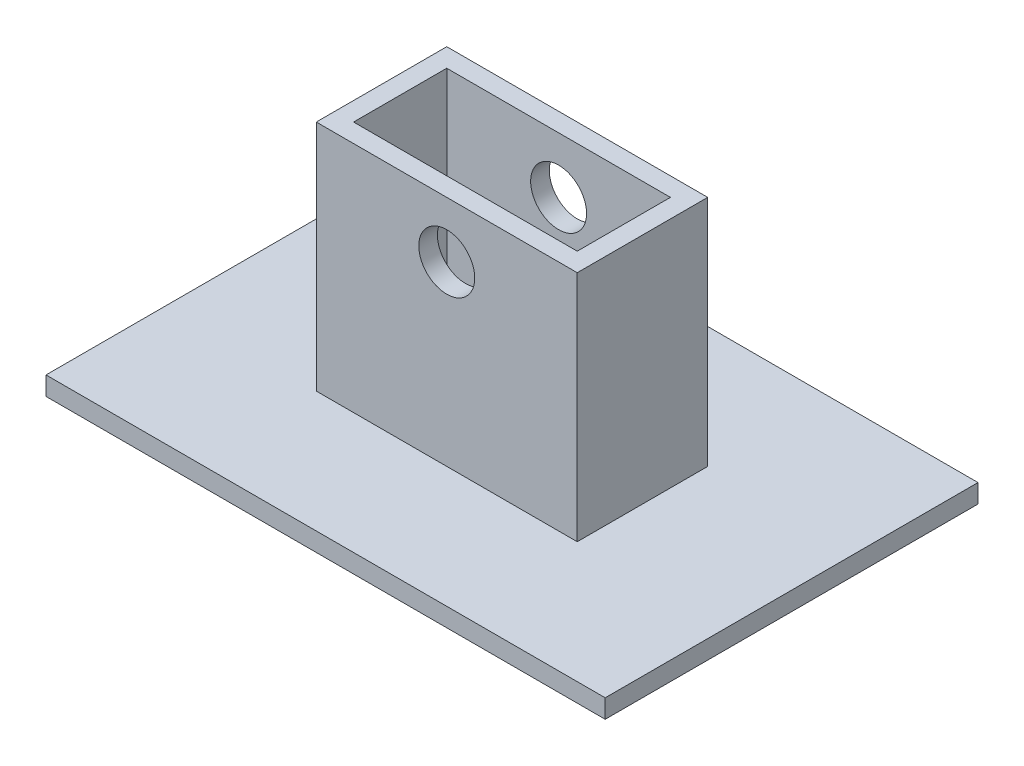
ISO-10303-21;
HEADER;
FILE_DESCRIPTION(('STEP AP214'),'2;1');
FILE_NAME('part.step','',(''),(''),'','','');
FILE_SCHEMA(('AUTOMOTIVE_DESIGN { 1 0 10303 214 1 1 1 1 }'));
ENDSEC;
DATA;
#1=APPLICATION_CONTEXT('core data for automotive mechanical design processes');
#2=APPLICATION_PROTOCOL_DEFINITION('international standard','automotive_design',2000,#1);
#3=PRODUCT_CONTEXT('',#1,'mechanical');
#4=PRODUCT('Part','Part','',(#3));
#5=PRODUCT_RELATED_PRODUCT_CATEGORY('part','',(#4));
#6=PRODUCT_DEFINITION_FORMATION('','',#4);
#7=PRODUCT_DEFINITION_CONTEXT('part definition',#1,'design');
#8=PRODUCT_DEFINITION('design','',#6,#7);
#9=PRODUCT_DEFINITION_SHAPE('','',#8);
#10=(LENGTH_UNIT() NAMED_UNIT(*) SI_UNIT(.MILLI.,.METRE.));
#11=(NAMED_UNIT(*) PLANE_ANGLE_UNIT() SI_UNIT($,.RADIAN.));
#12=(NAMED_UNIT(*) SI_UNIT($,.STERADIAN.) SOLID_ANGLE_UNIT());
#13=UNCERTAINTY_MEASURE_WITH_UNIT(LENGTH_MEASURE(1.E-05),#10,'distance_accuracy_value','');
#14=(GEOMETRIC_REPRESENTATION_CONTEXT(3) GLOBAL_UNCERTAINTY_ASSIGNED_CONTEXT((#13)) GLOBAL_UNIT_ASSIGNED_CONTEXT((#10,
#11,#12)) REPRESENTATION_CONTEXT('',''));
#15=CARTESIAN_POINT('',(0.,0.,0.));
#16=DIRECTION('',(0.,0.,1.));
#17=DIRECTION('',(1.,0.,0.));
#18=AXIS2_PLACEMENT_3D('',#15,#16,#17);
#19=CARTESIAN_POINT('',(0.,2.54,0.));
#20=DIRECTION('',(0.,1.,0.));
#21=DIRECTION('',(0.,0.,1.));
#22=AXIS2_PLACEMENT_3D('',#19,#20,#21);
#23=PLANE('',#22);
#24=DIRECTION('',(0.,0.,1.));
#25=VECTOR('',#24,1.);
#26=CARTESIAN_POINT('',(-38.1,2.54,-25.4));
#27=LINE('',#26,#25);
#28=CARTESIAN_POINT('',(-38.1,2.54,-25.4));
#29=VERTEX_POINT('',#28);
#30=CARTESIAN_POINT('',(-38.1,2.54,25.4));
#31=VERTEX_POINT('',#30);
#32=EDGE_CURVE('E193',#29,#31,#27,.T.);
#33=ORIENTED_EDGE('',*,*,#32,.T.);
#34=DIRECTION('',(1.,0.,0.));
#35=VECTOR('',#34,1.);
#36=CARTESIAN_POINT('',(-38.1,2.54,25.4));
#37=LINE('',#36,#35);
#38=CARTESIAN_POINT('',(38.1,2.54,25.4));
#39=VERTEX_POINT('',#38);
#40=EDGE_CURVE('E196',#31,#39,#37,.T.);
#41=ORIENTED_EDGE('',*,*,#40,.T.);
#42=DIRECTION('',(0.,0.,-1.));
#43=VECTOR('',#42,1.);
#44=CARTESIAN_POINT('',(38.1,2.54,-25.4));
#45=LINE('',#44,#43);
#46=CARTESIAN_POINT('',(38.1,2.54,-25.4));
#47=VERTEX_POINT('',#46);
#48=EDGE_CURVE('E199',#39,#47,#45,.T.);
#49=ORIENTED_EDGE('',*,*,#48,.T.);
#50=DIRECTION('',(-1.,0.,0.));
#51=VECTOR('',#50,1.);
#52=CARTESIAN_POINT('',(-38.1,2.54,-25.4));
#53=LINE('',#52,#51);
#54=EDGE_CURVE('E201',#47,#29,#53,.T.);
#55=ORIENTED_EDGE('',*,*,#54,.T.);
#56=EDGE_LOOP('',(#33,#41,#49,#55));
#57=FACE_BOUND('',#56,.T.);
#58=DIRECTION('',(1.,0.,0.));
#59=VECTOR('',#58,1.);
#60=CARTESIAN_POINT('',(-17.78,2.54,8.89));
#61=LINE('',#60,#59);
#62=CARTESIAN_POINT('',(-17.78,2.54,8.89));
#63=VERTEX_POINT('',#62);
#64=CARTESIAN_POINT('',(17.78,2.54,8.89));
#65=VERTEX_POINT('',#64);
#66=EDGE_CURVE('E179',#63,#65,#61,.T.);
#67=ORIENTED_EDGE('',*,*,#66,.F.);
#68=DIRECTION('',(0.,0.,1.));
#69=VECTOR('',#68,1.);
#70=CARTESIAN_POINT('',(-17.78,2.54,-8.89));
#71=LINE('',#70,#69);
#72=CARTESIAN_POINT('',(-17.78,2.54,-8.89));
#73=VERTEX_POINT('',#72);
#74=EDGE_CURVE('E142',#73,#63,#71,.T.);
#75=ORIENTED_EDGE('',*,*,#74,.F.);
#76=DIRECTION('',(-1.,0.,0.));
#77=VECTOR('',#76,1.);
#78=CARTESIAN_POINT('',(-17.78,2.54,-8.89));
#79=LINE('',#78,#77);
#80=CARTESIAN_POINT('',(17.78,2.54,-8.89));
#81=VERTEX_POINT('',#80);
#82=EDGE_CURVE('E170',#81,#73,#79,.T.);
#83=ORIENTED_EDGE('',*,*,#82,.F.);
#84=DIRECTION('',(0.,0.,-1.));
#85=VECTOR('',#84,1.);
#86=CARTESIAN_POINT('',(17.78,2.54,-8.89));
#87=LINE('',#86,#85);
#88=EDGE_CURVE('E181',#65,#81,#87,.T.);
#89=ORIENTED_EDGE('',*,*,#88,.F.);
#90=EDGE_LOOP('',(#67,#75,#83,#89));
#91=FACE_BOUND('',#90,.T.);
#92=ADVANCED_FACE('F33',(#57,#91),#23,.T.);
#93=CARTESIAN_POINT('',(-38.1,2.54,-25.4));
#94=DIRECTION('',(1.,0.,0.));
#95=DIRECTION('',(0.,0.,-1.));
#96=AXIS2_PLACEMENT_3D('',#93,#94,#95);
#97=PLANE('',#96);
#98=DIRECTION('',(0.,0.,1.));
#99=VECTOR('',#98,1.);
#100=CARTESIAN_POINT('',(-38.1,0.,-25.4));
#101=LINE('',#100,#99);
#102=CARTESIAN_POINT('',(-38.1,0.,-25.4));
#103=VERTEX_POINT('',#102);
#104=CARTESIAN_POINT('',(-38.1,0.,25.4));
#105=VERTEX_POINT('',#104);
#106=EDGE_CURVE('E192',#103,#105,#101,.T.);
#107=ORIENTED_EDGE('',*,*,#106,.T.);
#108=DIRECTION('',(0.,-1.,0.));
#109=VECTOR('',#108,1.);
#110=CARTESIAN_POINT('',(-38.1,2.54,25.4));
#111=LINE('',#110,#109);
#112=EDGE_CURVE('E11',#31,#105,#111,.T.);
#113=ORIENTED_EDGE('',*,*,#112,.F.);
#114=ORIENTED_EDGE('',*,*,#32,.F.);
#115=DIRECTION('',(0.,-1.,0.));
#116=VECTOR('',#115,1.);
#117=CARTESIAN_POINT('',(-38.1,2.54,-25.4));
#118=LINE('',#117,#116);
#119=EDGE_CURVE('E203',#29,#103,#118,.T.);
#120=ORIENTED_EDGE('',*,*,#119,.T.);
#121=EDGE_LOOP('',(#107,#113,#114,#120));
#122=FACE_BOUND('',#121,.T.);
#123=ADVANCED_FACE('F35',(#122),#97,.F.);
#124=CARTESIAN_POINT('',(-38.1,2.54,25.4));
#125=DIRECTION('',(0.,0.,-1.));
#126=DIRECTION('',(-1.,0.,0.));
#127=AXIS2_PLACEMENT_3D('',#124,#125,#126);
#128=PLANE('',#127);
#129=DIRECTION('',(1.,0.,0.));
#130=VECTOR('',#129,1.);
#131=CARTESIAN_POINT('',(-38.1,0.,25.4));
#132=LINE('',#131,#130);
#133=CARTESIAN_POINT('',(38.1,0.,25.4));
#134=VERTEX_POINT('',#133);
#135=EDGE_CURVE('E206',#105,#134,#132,.T.);
#136=ORIENTED_EDGE('',*,*,#135,.T.);
#137=DIRECTION('',(0.,-1.,0.));
#138=VECTOR('',#137,1.);
#139=CARTESIAN_POINT('',(38.1,2.54,25.4));
#140=LINE('',#139,#138);
#141=EDGE_CURVE('E42',#39,#134,#140,.T.);
#142=ORIENTED_EDGE('',*,*,#141,.F.);
#143=ORIENTED_EDGE('',*,*,#40,.F.);
#144=ORIENTED_EDGE('',*,*,#112,.T.);
#145=EDGE_LOOP('',(#136,#142,#143,#144));
#146=FACE_BOUND('',#145,.T.);
#147=ADVANCED_FACE('F237',(#146),#128,.F.);
#148=CARTESIAN_POINT('',(38.1,2.54,-25.4));
#149=DIRECTION('',(-1.,0.,0.));
#150=DIRECTION('',(0.,0.,1.));
#151=AXIS2_PLACEMENT_3D('',#148,#149,#150);
#152=PLANE('',#151);
#153=DIRECTION('',(0.,0.,-1.));
#154=VECTOR('',#153,1.);
#155=CARTESIAN_POINT('',(38.1,0.,-25.4));
#156=LINE('',#155,#154);
#157=CARTESIAN_POINT('',(38.1,0.,-25.4));
#158=VERTEX_POINT('',#157);
#159=EDGE_CURVE('E208',#134,#158,#156,.T.);
#160=ORIENTED_EDGE('',*,*,#159,.T.);
#161=DIRECTION('',(0.,-1.,0.));
#162=VECTOR('',#161,1.);
#163=CARTESIAN_POINT('',(38.1,2.54,-25.4));
#164=LINE('',#163,#162);
#165=EDGE_CURVE('E213',#47,#158,#164,.T.);
#166=ORIENTED_EDGE('',*,*,#165,.F.);
#167=ORIENTED_EDGE('',*,*,#48,.F.);
#168=ORIENTED_EDGE('',*,*,#141,.T.);
#169=EDGE_LOOP('',(#160,#166,#167,#168));
#170=FACE_BOUND('',#169,.T.);
#171=ADVANCED_FACE('F221',(#170),#152,.F.);
#172=CARTESIAN_POINT('',(-38.1,2.54,-25.4));
#173=DIRECTION('',(0.,0.,1.));
#174=DIRECTION('',(1.,0.,0.));
#175=AXIS2_PLACEMENT_3D('',#172,#173,#174);
#176=PLANE('',#175);
#177=DIRECTION('',(-1.,0.,0.));
#178=VECTOR('',#177,1.);
#179=CARTESIAN_POINT('',(-38.1,0.,-25.4));
#180=LINE('',#179,#178);
#181=EDGE_CURVE('E197',#158,#103,#180,.T.);
#182=ORIENTED_EDGE('',*,*,#181,.T.);
#183=ORIENTED_EDGE('',*,*,#119,.F.);
#184=ORIENTED_EDGE('',*,*,#54,.F.);
#185=ORIENTED_EDGE('',*,*,#165,.T.);
#186=EDGE_LOOP('',(#182,#183,#184,#185));
#187=FACE_BOUND('',#186,.T.);
#188=ADVANCED_FACE('F230',(#187),#176,.F.);
#189=CARTESIAN_POINT('',(0.,0.,0.));
#190=DIRECTION('',(0.,1.,0.));
#191=DIRECTION('',(0.,0.,1.));
#192=AXIS2_PLACEMENT_3D('',#189,#190,#191);
#193=PLANE('',#192);
#194=ORIENTED_EDGE('',*,*,#106,.F.);
#195=ORIENTED_EDGE('',*,*,#181,.F.);
#196=ORIENTED_EDGE('',*,*,#159,.F.);
#197=ORIENTED_EDGE('',*,*,#135,.F.);
#198=EDGE_LOOP('',(#194,#195,#196,#197));
#199=FACE_BOUND('',#198,.T.);
#200=ADVANCED_FACE('F227',(#199),#193,.F.);
#201=CARTESIAN_POINT('',(0.,34.29,0.));
#202=DIRECTION('',(0.,1.,0.));
#203=DIRECTION('',(0.,0.,1.));
#204=AXIS2_PLACEMENT_3D('',#201,#202,#203);
#205=PLANE('',#204);
#206=DIRECTION('',(0.,0.,1.));
#207=VECTOR('',#206,1.);
#208=CARTESIAN_POINT('',(-17.78,34.29,-8.89));
#209=LINE('',#208,#207);
#210=CARTESIAN_POINT('',(-17.78,34.29,-8.89));
#211=VERTEX_POINT('',#210);
#212=CARTESIAN_POINT('',(-17.78,34.29,8.89));
#213=VERTEX_POINT('',#212);
#214=EDGE_CURVE('E166',#211,#213,#209,.T.);
#215=ORIENTED_EDGE('',*,*,#214,.T.);
#216=DIRECTION('',(1.,0.,0.));
#217=VECTOR('',#216,1.);
#218=CARTESIAN_POINT('',(-17.78,34.29,8.89));
#219=LINE('',#218,#217);
#220=CARTESIAN_POINT('',(17.78,34.29,8.89));
#221=VERTEX_POINT('',#220);
#222=EDGE_CURVE('E169',#213,#221,#219,.T.);
#223=ORIENTED_EDGE('',*,*,#222,.T.);
#224=DIRECTION('',(0.,0.,-1.));
#225=VECTOR('',#224,1.);
#226=CARTESIAN_POINT('',(17.78,34.29,-8.89));
#227=LINE('',#226,#225);
#228=CARTESIAN_POINT('',(17.78,34.29,-8.89));
#229=VERTEX_POINT('',#228);
#230=EDGE_CURVE('E172',#221,#229,#227,.T.);
#231=ORIENTED_EDGE('',*,*,#230,.T.);
#232=DIRECTION('',(-1.,0.,0.));
#233=VECTOR('',#232,1.);
#234=CARTESIAN_POINT('',(-17.78,34.29,-8.89));
#235=LINE('',#234,#233);
#236=EDGE_CURVE('E174',#229,#211,#235,.T.);
#237=ORIENTED_EDGE('',*,*,#236,.T.);
#238=EDGE_LOOP('',(#215,#223,#231,#237));
#239=FACE_BOUND('',#238,.T.);
#240=DIRECTION('',(1.,0.,0.));
#241=VECTOR('',#240,1.);
#242=CARTESIAN_POINT('',(-15.24,34.29,6.35));
#243=LINE('',#242,#241);
#244=CARTESIAN_POINT('',(-15.24,34.29,6.35));
#245=VERTEX_POINT('',#244);
#246=CARTESIAN_POINT('',(15.24,34.29,6.35));
#247=VERTEX_POINT('',#246);
#248=EDGE_CURVE('E134',#245,#247,#243,.T.);
#249=ORIENTED_EDGE('',*,*,#248,.F.);
#250=DIRECTION('',(0.,0.,1.));
#251=VECTOR('',#250,1.);
#252=CARTESIAN_POINT('',(-15.24,34.29,-6.35));
#253=LINE('',#252,#251);
#254=CARTESIAN_POINT('',(-15.24,34.29,-6.35));
#255=VERTEX_POINT('',#254);
#256=EDGE_CURVE('E125',#255,#245,#253,.T.);
#257=ORIENTED_EDGE('',*,*,#256,.F.);
#258=DIRECTION('',(-1.,0.,0.));
#259=VECTOR('',#258,1.);
#260=CARTESIAN_POINT('',(-15.24,34.29,-6.35));
#261=LINE('',#260,#259);
#262=CARTESIAN_POINT('',(15.24,34.29,-6.35));
#263=VERTEX_POINT('',#262);
#264=EDGE_CURVE('E150',#263,#255,#261,.T.);
#265=ORIENTED_EDGE('',*,*,#264,.F.);
#266=DIRECTION('',(0.,0.,-1.));
#267=VECTOR('',#266,1.);
#268=CARTESIAN_POINT('',(15.24,34.29,-6.35));
#269=LINE('',#268,#267);
#270=EDGE_CURVE('E148',#247,#263,#269,.T.);
#271=ORIENTED_EDGE('',*,*,#270,.F.);
#272=EDGE_LOOP('',(#249,#257,#265,#271));
#273=FACE_BOUND('',#272,.T.);
#274=ADVANCED_FACE('F146',(#239,#273),#205,.T.);
#275=CARTESIAN_POINT('',(-17.78,34.29,-8.89));
#276=DIRECTION('',(1.,0.,0.));
#277=DIRECTION('',(0.,0.,-1.));
#278=AXIS2_PLACEMENT_3D('',#275,#276,#277);
#279=PLANE('',#278);
#280=ORIENTED_EDGE('',*,*,#74,.T.);
#281=DIRECTION('',(0.,-1.,0.));
#282=VECTOR('',#281,1.);
#283=CARTESIAN_POINT('',(-17.78,34.29,8.89));
#284=LINE('',#283,#282);
#285=EDGE_CURVE('E190',#213,#63,#284,.T.);
#286=ORIENTED_EDGE('',*,*,#285,.F.);
#287=ORIENTED_EDGE('',*,*,#214,.F.);
#288=DIRECTION('',(0.,-1.,0.));
#289=VECTOR('',#288,1.);
#290=CARTESIAN_POINT('',(-17.78,34.29,-8.89));
#291=LINE('',#290,#289);
#292=EDGE_CURVE('E176',#211,#73,#291,.T.);
#293=ORIENTED_EDGE('',*,*,#292,.T.);
#294=EDGE_LOOP('',(#280,#286,#287,#293));
#295=FACE_BOUND('',#294,.T.);
#296=ADVANCED_FACE('F280',(#295),#279,.F.);
#297=CARTESIAN_POINT('',(-17.78,34.29,8.89));
#298=DIRECTION('',(0.,0.,-1.));
#299=DIRECTION('',(-1.,0.,0.));
#300=AXIS2_PLACEMENT_3D('',#297,#298,#299);
#301=PLANE('',#300);
#302=CARTESIAN_POINT('',(0.,26.67,8.89));
#303=DIRECTION('',(0.,0.,1.));
#304=DIRECTION('',(1.,0.,0.));
#305=AXIS2_PLACEMENT_3D('',#302,#303,#304);
#306=CIRCLE('',#305,3.81);
#307=CARTESIAN_POINT('',(3.81,26.67,8.89));
#308=VERTEX_POINT('',#307);
#309=EDGE_CURVE('E415',#308,#308,#306,.T.);
#310=ORIENTED_EDGE('',*,*,#309,.F.);
#311=EDGE_LOOP('',(#310));
#312=FACE_BOUND('',#311,.T.);
#313=ORIENTED_EDGE('',*,*,#66,.T.);
#314=DIRECTION('',(0.,-1.,0.));
#315=VECTOR('',#314,1.);
#316=CARTESIAN_POINT('',(17.78,34.29,8.89));
#317=LINE('',#316,#315);
#318=EDGE_CURVE('E187',#221,#65,#317,.T.);
#319=ORIENTED_EDGE('',*,*,#318,.F.);
#320=ORIENTED_EDGE('',*,*,#222,.F.);
#321=ORIENTED_EDGE('',*,*,#285,.T.);
#322=EDGE_LOOP('',(#313,#319,#320,#321));
#323=FACE_BOUND('',#322,.T.);
#324=ADVANCED_FACE('F288',(#312,#323),#301,.F.);
#325=CARTESIAN_POINT('',(17.78,34.29,-8.89));
#326=DIRECTION('',(-1.,0.,0.));
#327=DIRECTION('',(0.,0.,1.));
#328=AXIS2_PLACEMENT_3D('',#325,#326,#327);
#329=PLANE('',#328);
#330=ORIENTED_EDGE('',*,*,#88,.T.);
#331=DIRECTION('',(0.,-1.,0.));
#332=VECTOR('',#331,1.);
#333=CARTESIAN_POINT('',(17.78,34.29,-8.89));
#334=LINE('',#333,#332);
#335=EDGE_CURVE('E49',#229,#81,#334,.T.);
#336=ORIENTED_EDGE('',*,*,#335,.F.);
#337=ORIENTED_EDGE('',*,*,#230,.F.);
#338=ORIENTED_EDGE('',*,*,#318,.T.);
#339=EDGE_LOOP('',(#330,#336,#337,#338));
#340=FACE_BOUND('',#339,.T.);
#341=ADVANCED_FACE('F284',(#340),#329,.F.);
#342=CARTESIAN_POINT('',(-17.78,34.29,-8.89));
#343=DIRECTION('',(0.,0.,1.));
#344=DIRECTION('',(1.,0.,0.));
#345=AXIS2_PLACEMENT_3D('',#342,#343,#344);
#346=PLANE('',#345);
#347=CARTESIAN_POINT('',(0.,26.67,-8.89));
#348=DIRECTION('',(0.,0.,1.));
#349=DIRECTION('',(1.,0.,0.));
#350=AXIS2_PLACEMENT_3D('',#347,#348,#349);
#351=CIRCLE('',#350,3.81);
#352=CARTESIAN_POINT('',(3.81,26.67,-8.89));
#353=VERTEX_POINT('',#352);
#354=EDGE_CURVE('E156',#353,#353,#351,.T.);
#355=ORIENTED_EDGE('',*,*,#354,.T.);
#356=EDGE_LOOP('',(#355));
#357=FACE_BOUND('',#356,.T.);
#358=ORIENTED_EDGE('',*,*,#82,.T.);
#359=ORIENTED_EDGE('',*,*,#292,.F.);
#360=ORIENTED_EDGE('',*,*,#236,.F.);
#361=ORIENTED_EDGE('',*,*,#335,.T.);
#362=EDGE_LOOP('',(#358,#359,#360,#361));
#363=FACE_BOUND('',#362,.T.);
#364=ADVANCED_FACE('F277',(#357,#363),#346,.F.);
#365=CARTESIAN_POINT('',(-15.24,34.29,-6.35));
#366=DIRECTION('',(1.,0.,0.));
#367=DIRECTION('',(0.,0.,-1.));
#368=AXIS2_PLACEMENT_3D('',#365,#366,#367);
#369=PLANE('',#368);
#370=DIRECTION('',(0.,0.,1.));
#371=VECTOR('',#370,1.);
#372=CARTESIAN_POINT('',(-15.24,2.54,-6.35));
#373=LINE('',#372,#371);
#374=CARTESIAN_POINT('',(-15.24,2.54,-6.35));
#375=VERTEX_POINT('',#374);
#376=CARTESIAN_POINT('',(-15.24,2.54,6.35));
#377=VERTEX_POINT('',#376);
#378=EDGE_CURVE('E57',#375,#377,#373,.T.);
#379=ORIENTED_EDGE('',*,*,#378,.F.);
#380=DIRECTION('',(0.,-1.,0.));
#381=VECTOR('',#380,1.);
#382=CARTESIAN_POINT('',(-15.24,34.29,-6.35));
#383=LINE('',#382,#381);
#384=EDGE_CURVE('E130',#255,#375,#383,.T.);
#385=ORIENTED_EDGE('',*,*,#384,.F.);
#386=ORIENTED_EDGE('',*,*,#256,.T.);
#387=DIRECTION('',(0.,-1.,0.));
#388=VECTOR('',#387,1.);
#389=CARTESIAN_POINT('',(-15.24,34.29,6.35));
#390=LINE('',#389,#388);
#391=EDGE_CURVE('E128',#245,#377,#390,.T.);
#392=ORIENTED_EDGE('',*,*,#391,.T.);
#393=EDGE_LOOP('',(#379,#385,#386,#392));
#394=FACE_BOUND('',#393,.T.);
#395=ADVANCED_FACE('F127',(#394),#369,.T.);
#396=CARTESIAN_POINT('',(-15.24,34.29,6.35));
#397=DIRECTION('',(0.,0.,-1.));
#398=DIRECTION('',(-1.,0.,0.));
#399=AXIS2_PLACEMENT_3D('',#396,#397,#398);
#400=PLANE('',#399);
#401=CARTESIAN_POINT('',(0.,26.67,6.35));
#402=DIRECTION('',(0.,0.,-1.));
#403=DIRECTION('',(-1.,0.,0.));
#404=AXIS2_PLACEMENT_3D('',#401,#402,#403);
#405=CIRCLE('',#404,3.81);
#406=CARTESIAN_POINT('',(-3.81,26.67,6.35));
#407=VERTEX_POINT('',#406);
#408=EDGE_CURVE('E412',#407,#407,#405,.T.);
#409=ORIENTED_EDGE('',*,*,#408,.F.);
#410=EDGE_LOOP('',(#409));
#411=FACE_BOUND('',#410,.T.);
#412=DIRECTION('',(1.,0.,0.));
#413=VECTOR('',#412,1.);
#414=CARTESIAN_POINT('',(-15.24,2.54,6.35));
#415=LINE('',#414,#413);
#416=CARTESIAN_POINT('',(15.24,2.54,6.35));
#417=VERTEX_POINT('',#416);
#418=EDGE_CURVE('E141',#377,#417,#415,.T.);
#419=ORIENTED_EDGE('',*,*,#418,.F.);
#420=ORIENTED_EDGE('',*,*,#391,.F.);
#421=ORIENTED_EDGE('',*,*,#248,.T.);
#422=DIRECTION('',(0.,-1.,0.));
#423=VECTOR('',#422,1.);
#424=CARTESIAN_POINT('',(15.24,34.29,6.35));
#425=LINE('',#424,#423);
#426=EDGE_CURVE('E143',#247,#417,#425,.T.);
#427=ORIENTED_EDGE('',*,*,#426,.T.);
#428=EDGE_LOOP('',(#419,#420,#421,#427));
#429=FACE_BOUND('',#428,.T.);
#430=ADVANCED_FACE('F138',(#411,#429),#400,.T.);
#431=CARTESIAN_POINT('',(15.24,34.29,-6.35));
#432=DIRECTION('',(-1.,0.,0.));
#433=DIRECTION('',(0.,0.,1.));
#434=AXIS2_PLACEMENT_3D('',#431,#432,#433);
#435=PLANE('',#434);
#436=DIRECTION('',(0.,0.,-1.));
#437=VECTOR('',#436,1.);
#438=CARTESIAN_POINT('',(15.24,2.54,-6.35));
#439=LINE('',#438,#437);
#440=CARTESIAN_POINT('',(15.24,2.54,-6.35));
#441=VERTEX_POINT('',#440);
#442=EDGE_CURVE('E158',#417,#441,#439,.T.);
#443=ORIENTED_EDGE('',*,*,#442,.F.);
#444=ORIENTED_EDGE('',*,*,#426,.F.);
#445=ORIENTED_EDGE('',*,*,#270,.T.);
#446=DIRECTION('',(0.,-1.,0.));
#447=VECTOR('',#446,1.);
#448=CARTESIAN_POINT('',(15.24,34.29,-6.35));
#449=LINE('',#448,#447);
#450=EDGE_CURVE('E162',#263,#441,#449,.T.);
#451=ORIENTED_EDGE('',*,*,#450,.T.);
#452=EDGE_LOOP('',(#443,#444,#445,#451));
#453=FACE_BOUND('',#452,.T.);
#454=ADVANCED_FACE('F261',(#453),#435,.T.);
#455=CARTESIAN_POINT('',(-15.24,34.29,-6.35));
#456=DIRECTION('',(0.,0.,1.));
#457=DIRECTION('',(1.,0.,0.));
#458=AXIS2_PLACEMENT_3D('',#455,#456,#457);
#459=PLANE('',#458);
#460=CARTESIAN_POINT('',(0.,26.67,-6.35));
#461=DIRECTION('',(0.,0.,1.));
#462=DIRECTION('',(1.,0.,0.));
#463=AXIS2_PLACEMENT_3D('',#460,#461,#462);
#464=CIRCLE('',#463,3.81);
#465=CARTESIAN_POINT('',(3.81,26.67,-6.35));
#466=VERTEX_POINT('',#465);
#467=EDGE_CURVE('E37',#466,#466,#464,.T.);
#468=ORIENTED_EDGE('',*,*,#467,.F.);
#469=EDGE_LOOP('',(#468));
#470=FACE_BOUND('',#469,.T.);
#471=DIRECTION('',(-1.,0.,0.));
#472=VECTOR('',#471,1.);
#473=CARTESIAN_POINT('',(-15.24,2.54,-6.35));
#474=LINE('',#473,#472);
#475=EDGE_CURVE('E135',#441,#375,#474,.T.);
#476=ORIENTED_EDGE('',*,*,#475,.F.);
#477=ORIENTED_EDGE('',*,*,#450,.F.);
#478=ORIENTED_EDGE('',*,*,#264,.T.);
#479=ORIENTED_EDGE('',*,*,#384,.T.);
#480=EDGE_LOOP('',(#476,#477,#478,#479));
#481=FACE_BOUND('',#480,.T.);
#482=ADVANCED_FACE('F253',(#470,#481),#459,.T.);
#483=ORIENTED_EDGE('',*,*,#378,.T.);
#484=ORIENTED_EDGE('',*,*,#418,.T.);
#485=ORIENTED_EDGE('',*,*,#442,.T.);
#486=ORIENTED_EDGE('',*,*,#475,.T.);
#487=EDGE_LOOP('',(#483,#484,#485,#486));
#488=FACE_BOUND('',#487,.T.);
#489=ADVANCED_FACE('F246',(#488),#23,.T.);
#490=CARTESIAN_POINT('',(0.,26.67,-22.86));
#491=DIRECTION('',(0.,0.,1.));
#492=DIRECTION('',(1.,0.,0.));
#493=AXIS2_PLACEMENT_3D('',#490,#491,#492);
#494=CYLINDRICAL_SURFACE('',#493,3.81);
#495=ORIENTED_EDGE('',*,*,#467,.T.);
#496=EDGE_LOOP('',(#495));
#497=FACE_BOUND('',#496,.T.);
#498=ORIENTED_EDGE('',*,*,#354,.F.);
#499=EDGE_LOOP('',(#498));
#500=FACE_BOUND('',#499,.T.);
#501=ADVANCED_FACE('F252',(#497,#500),#494,.F.);
#502=ORIENTED_EDGE('',*,*,#408,.T.);
#503=EDGE_LOOP('',(#502));
#504=FACE_BOUND('',#503,.T.);
#505=ORIENTED_EDGE('',*,*,#309,.T.);
#506=EDGE_LOOP('',(#505));
#507=FACE_BOUND('',#506,.T.);
#508=ADVANCED_FACE('F258',(#504,#507),#494,.F.);
#509=CLOSED_SHELL('',(#92,#123,#147,#171,#188,#200,#274,#296,#324,#341,#364,#395,#430,#454,#482,
#489,#501,#508));
#510=MANIFOLD_SOLID_BREP('B2',#509);
#511=ADVANCED_BREP_SHAPE_REPRESENTATION('',(#18,#510),#14);
#512=SHAPE_DEFINITION_REPRESENTATION(#9,#511);
ENDSEC;
END-ISO-10303-21;
